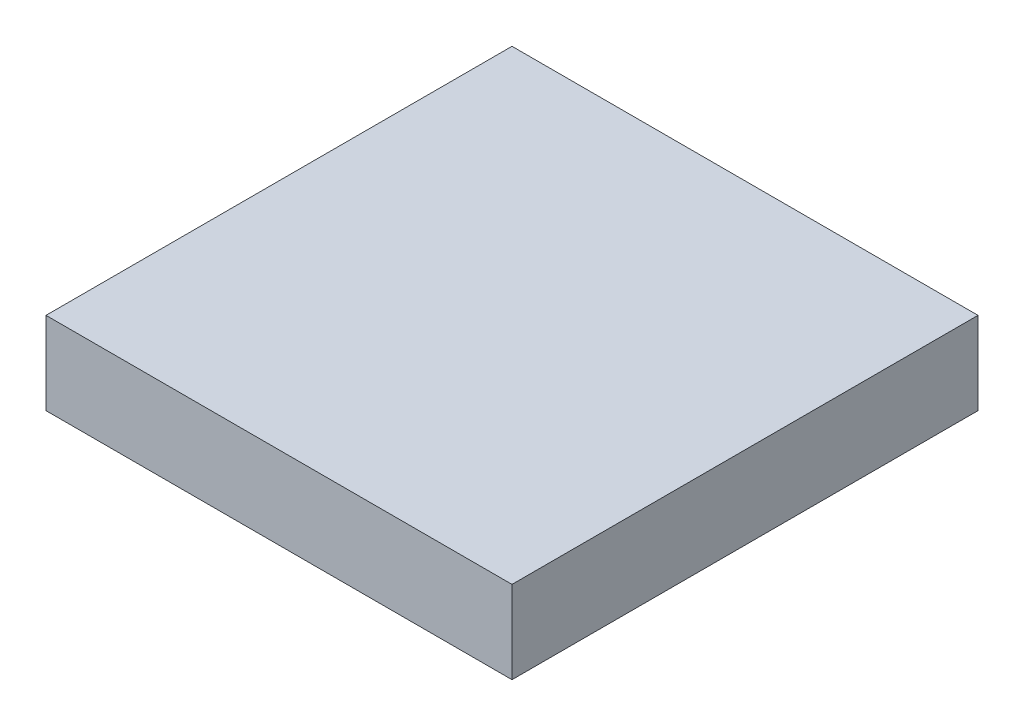
ISO-10303-21;
HEADER;
FILE_DESCRIPTION(('STEP AP214'),'2;1');
FILE_NAME('part.step','',(''),(''),'','','');
FILE_SCHEMA(('AUTOMOTIVE_DESIGN { 1 0 10303 214 1 1 1 1 }'));
ENDSEC;
DATA;
#1=APPLICATION_CONTEXT('core data for automotive mechanical design processes');
#2=APPLICATION_PROTOCOL_DEFINITION('international standard','automotive_design',2000,#1);
#3=PRODUCT_CONTEXT('',#1,'mechanical');
#4=PRODUCT('Part','Part','',(#3));
#5=PRODUCT_RELATED_PRODUCT_CATEGORY('part','',(#4));
#6=PRODUCT_DEFINITION_FORMATION('','',#4);
#7=PRODUCT_DEFINITION_CONTEXT('part definition',#1,'design');
#8=PRODUCT_DEFINITION('design','',#6,#7);
#9=PRODUCT_DEFINITION_SHAPE('','',#8);
#10=(LENGTH_UNIT() NAMED_UNIT(*) SI_UNIT(.MILLI.,.METRE.));
#11=(NAMED_UNIT(*) PLANE_ANGLE_UNIT() SI_UNIT($,.RADIAN.));
#12=(NAMED_UNIT(*) SI_UNIT($,.STERADIAN.) SOLID_ANGLE_UNIT());
#13=UNCERTAINTY_MEASURE_WITH_UNIT(LENGTH_MEASURE(1.E-05),#10,'distance_accuracy_value','');
#14=(GEOMETRIC_REPRESENTATION_CONTEXT(3) GLOBAL_UNCERTAINTY_ASSIGNED_CONTEXT((#13)) GLOBAL_UNIT_ASSIGNED_CONTEXT((#10,
#11,#12)) REPRESENTATION_CONTEXT('',''));
#15=CARTESIAN_POINT('',(0.,0.,0.));
#16=DIRECTION('',(0.,0.,1.));
#17=DIRECTION('',(1.,0.,0.));
#18=AXIS2_PLACEMENT_3D('',#15,#16,#17);
#19=CARTESIAN_POINT('',(-12.7,4.5,12.7));
#20=DIRECTION('',(1.,0.,0.));
#21=DIRECTION('',(0.,0.,-1.));
#22=AXIS2_PLACEMENT_3D('',#19,#20,#21);
#23=PLANE('',#22);
#24=DIRECTION('',(0.,0.,1.));
#25=VECTOR('',#24,1.);
#26=CARTESIAN_POINT('',(-12.7,0.,12.7));
#27=LINE('',#26,#25);
#28=CARTESIAN_POINT('',(-12.7,0.,-12.7));
#29=VERTEX_POINT('',#28);
#30=CARTESIAN_POINT('',(-12.7,0.,12.7));
#31=VERTEX_POINT('',#30);
#32=EDGE_CURVE('E96',#29,#31,#27,.T.);
#33=ORIENTED_EDGE('',*,*,#32,.T.);
#34=DIRECTION('',(0.,-1.,0.));
#35=VECTOR('',#34,1.);
#36=CARTESIAN_POINT('',(-12.7,4.5,12.7));
#37=LINE('',#36,#35);
#38=CARTESIAN_POINT('',(-12.7,4.5,12.7));
#39=VERTEX_POINT('',#38);
#40=EDGE_CURVE('E11',#39,#31,#37,.T.);
#41=ORIENTED_EDGE('',*,*,#40,.F.);
#42=DIRECTION('',(0.,0.,1.));
#43=VECTOR('',#42,1.);
#44=CARTESIAN_POINT('',(-12.7,4.5,12.7));
#45=LINE('',#44,#43);
#46=CARTESIAN_POINT('',(-12.7,4.5,-12.7));
#47=VERTEX_POINT('',#46);
#48=EDGE_CURVE('E84',#47,#39,#45,.T.);
#49=ORIENTED_EDGE('',*,*,#48,.F.);
#50=DIRECTION('',(0.,-1.,0.));
#51=VECTOR('',#50,1.);
#52=CARTESIAN_POINT('',(-12.7,4.5,-12.7));
#53=LINE('',#52,#51);
#54=EDGE_CURVE('E92',#47,#29,#53,.T.);
#55=ORIENTED_EDGE('',*,*,#54,.T.);
#56=EDGE_LOOP('',(#33,#41,#49,#55));
#57=FACE_BOUND('',#56,.T.);
#58=ADVANCED_FACE('F33',(#57),#23,.F.);
#59=CARTESIAN_POINT('',(12.7,4.5,12.7));
#60=DIRECTION('',(0.,0.,-1.));
#61=DIRECTION('',(-1.,0.,0.));
#62=AXIS2_PLACEMENT_3D('',#59,#60,#61);
#63=PLANE('',#62);
#64=DIRECTION('',(1.,0.,0.));
#65=VECTOR('',#64,1.);
#66=CARTESIAN_POINT('',(12.7,0.,12.7));
#67=LINE('',#66,#65);
#68=CARTESIAN_POINT('',(12.7,0.,12.7));
#69=VERTEX_POINT('',#68);
#70=EDGE_CURVE('E88',#31,#69,#67,.T.);
#71=ORIENTED_EDGE('',*,*,#70,.T.);
#72=DIRECTION('',(0.,-1.,0.));
#73=VECTOR('',#72,1.);
#74=CARTESIAN_POINT('',(12.7,4.5,12.7));
#75=LINE('',#74,#73);
#76=CARTESIAN_POINT('',(12.7,4.5,12.7));
#77=VERTEX_POINT('',#76);
#78=EDGE_CURVE('E41',#77,#69,#75,.T.);
#79=ORIENTED_EDGE('',*,*,#78,.F.);
#80=DIRECTION('',(1.,0.,0.));
#81=VECTOR('',#80,1.);
#82=CARTESIAN_POINT('',(12.7,4.5,12.7));
#83=LINE('',#82,#81);
#84=EDGE_CURVE('E79',#39,#77,#83,.T.);
#85=ORIENTED_EDGE('',*,*,#84,.F.);
#86=ORIENTED_EDGE('',*,*,#40,.T.);
#87=EDGE_LOOP('',(#71,#79,#85,#86));
#88=FACE_BOUND('',#87,.T.);
#89=ADVANCED_FACE('F87',(#88),#63,.F.);
#90=CARTESIAN_POINT('',(12.7,4.5,12.7));
#91=DIRECTION('',(-1.,0.,0.));
#92=DIRECTION('',(0.,0.,1.));
#93=AXIS2_PLACEMENT_3D('',#90,#91,#92);
#94=PLANE('',#93);
#95=DIRECTION('',(0.,0.,-1.));
#96=VECTOR('',#95,1.);
#97=CARTESIAN_POINT('',(12.7,0.,12.7));
#98=LINE('',#97,#96);
#99=CARTESIAN_POINT('',(12.7,0.,-12.7));
#100=VERTEX_POINT('',#99);
#101=EDGE_CURVE('E66',#69,#100,#98,.T.);
#102=ORIENTED_EDGE('',*,*,#101,.T.);
#103=DIRECTION('',(0.,-1.,0.));
#104=VECTOR('',#103,1.);
#105=CARTESIAN_POINT('',(12.7,4.5,-12.7));
#106=LINE('',#105,#104);
#107=CARTESIAN_POINT('',(12.7,4.5,-12.7));
#108=VERTEX_POINT('',#107);
#109=EDGE_CURVE('E89',#108,#100,#106,.T.);
#110=ORIENTED_EDGE('',*,*,#109,.F.);
#111=DIRECTION('',(0.,0.,-1.));
#112=VECTOR('',#111,1.);
#113=CARTESIAN_POINT('',(12.7,4.5,12.7));
#114=LINE('',#113,#112);
#115=EDGE_CURVE('E82',#77,#108,#114,.T.);
#116=ORIENTED_EDGE('',*,*,#115,.F.);
#117=ORIENTED_EDGE('',*,*,#78,.T.);
#118=EDGE_LOOP('',(#102,#110,#116,#117));
#119=FACE_BOUND('',#118,.T.);
#120=ADVANCED_FACE('F90',(#119),#94,.F.);
#121=CARTESIAN_POINT('',(12.7,4.5,-12.7));
#122=DIRECTION('',(0.,0.,1.));
#123=DIRECTION('',(1.,0.,0.));
#124=AXIS2_PLACEMENT_3D('',#121,#122,#123);
#125=PLANE('',#124);
#126=DIRECTION('',(-1.,0.,0.));
#127=VECTOR('',#126,1.);
#128=CARTESIAN_POINT('',(12.7,0.,-12.7));
#129=LINE('',#128,#127);
#130=EDGE_CURVE('E72',#100,#29,#129,.T.);
#131=ORIENTED_EDGE('',*,*,#130,.T.);
#132=ORIENTED_EDGE('',*,*,#54,.F.);
#133=DIRECTION('',(-1.,0.,0.));
#134=VECTOR('',#133,1.);
#135=CARTESIAN_POINT('',(12.7,4.5,-12.7));
#136=LINE('',#135,#134);
#137=EDGE_CURVE('E49',#108,#47,#136,.T.);
#138=ORIENTED_EDGE('',*,*,#137,.F.);
#139=ORIENTED_EDGE('',*,*,#109,.T.);
#140=EDGE_LOOP('',(#131,#132,#138,#139));
#141=FACE_BOUND('',#140,.T.);
#142=ADVANCED_FACE('F103',(#141),#125,.F.);
#143=CARTESIAN_POINT('',(0.,4.5,0.));
#144=DIRECTION('',(0.,1.,0.));
#145=DIRECTION('',(0.,0.,1.));
#146=AXIS2_PLACEMENT_3D('',#143,#144,#145);
#147=PLANE('',#146);
#148=ORIENTED_EDGE('',*,*,#48,.T.);
#149=ORIENTED_EDGE('',*,*,#84,.T.);
#150=ORIENTED_EDGE('',*,*,#115,.T.);
#151=ORIENTED_EDGE('',*,*,#137,.T.);
#152=EDGE_LOOP('',(#148,#149,#150,#151));
#153=FACE_BOUND('',#152,.T.);
#154=ADVANCED_FACE('F80',(#153),#147,.T.);
#155=CARTESIAN_POINT('',(0.,0.,0.));
#156=DIRECTION('',(0.,1.,0.));
#157=DIRECTION('',(0.,0.,1.));
#158=AXIS2_PLACEMENT_3D('',#155,#156,#157);
#159=PLANE('',#158);
#160=ORIENTED_EDGE('',*,*,#32,.F.);
#161=ORIENTED_EDGE('',*,*,#130,.F.);
#162=ORIENTED_EDGE('',*,*,#101,.F.);
#163=ORIENTED_EDGE('',*,*,#70,.F.);
#164=EDGE_LOOP('',(#160,#161,#162,#163));
#165=FACE_BOUND('',#164,.T.);
#166=ADVANCED_FACE('F106',(#165),#159,.F.);
#167=CLOSED_SHELL('',(#58,#89,#120,#142,#154,#166));
#168=MANIFOLD_SOLID_BREP('B2',#167);
#169=ADVANCED_BREP_SHAPE_REPRESENTATION('',(#18,#168),#14);
#170=SHAPE_DEFINITION_REPRESENTATION(#9,#169);
ENDSEC;
END-ISO-10303-21;
